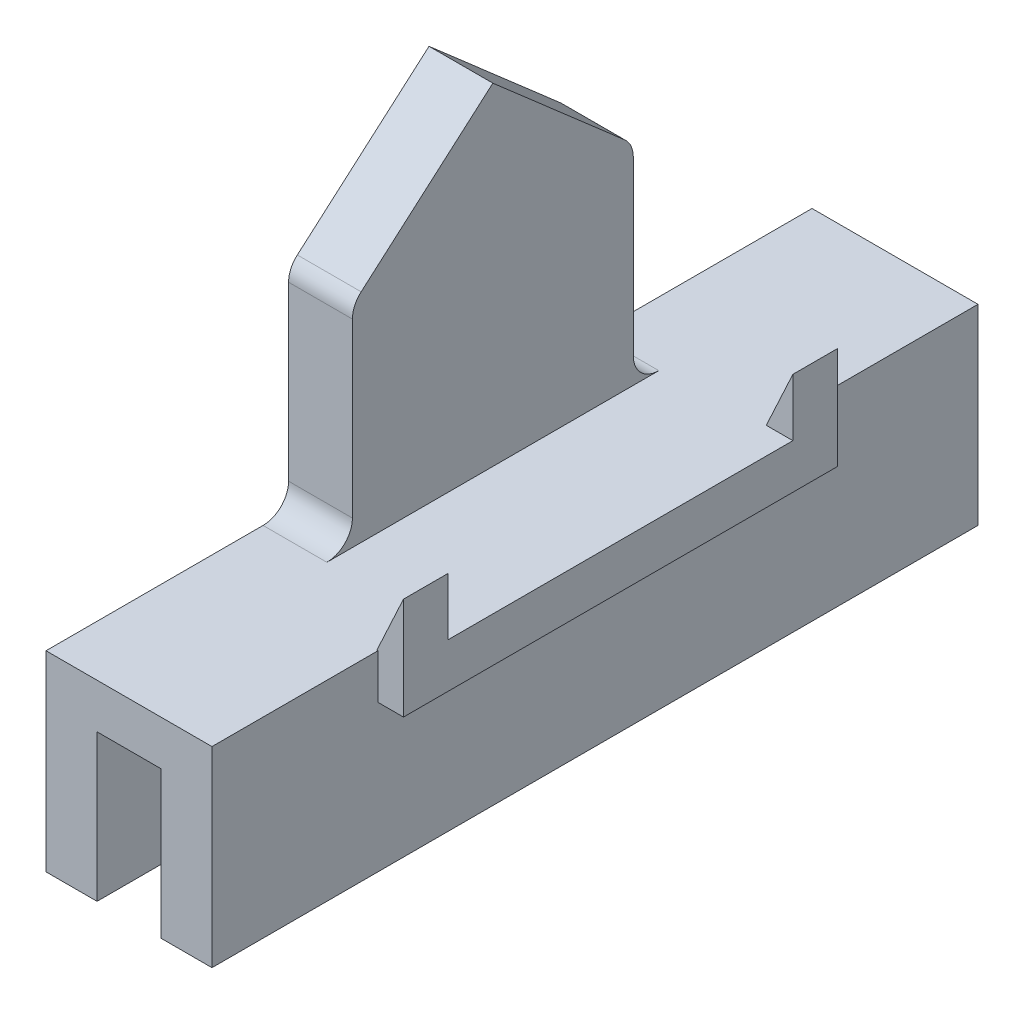
ISO-10303-21;
HEADER;
FILE_DESCRIPTION(('STEP AP214'),'2;1');
FILE_NAME('part.step','',(''),(''),'','','');
FILE_SCHEMA(('AUTOMOTIVE_DESIGN { 1 0 10303 214 1 1 1 1 }'));
ENDSEC;
DATA;
#1=APPLICATION_CONTEXT('core data for automotive mechanical design processes');
#2=APPLICATION_PROTOCOL_DEFINITION('international standard','automotive_design',2000,#1);
#3=PRODUCT_CONTEXT('',#1,'mechanical');
#4=PRODUCT('Part','Part','',(#3));
#5=PRODUCT_RELATED_PRODUCT_CATEGORY('part','',(#4));
#6=PRODUCT_DEFINITION_FORMATION('','',#4);
#7=PRODUCT_DEFINITION_CONTEXT('part definition',#1,'design');
#8=PRODUCT_DEFINITION('design','',#6,#7);
#9=PRODUCT_DEFINITION_SHAPE('','',#8);
#10=(LENGTH_UNIT() NAMED_UNIT(*) SI_UNIT(.MILLI.,.METRE.));
#11=(NAMED_UNIT(*) PLANE_ANGLE_UNIT() SI_UNIT($,.RADIAN.));
#12=(NAMED_UNIT(*) SI_UNIT($,.STERADIAN.) SOLID_ANGLE_UNIT());
#13=UNCERTAINTY_MEASURE_WITH_UNIT(LENGTH_MEASURE(1.E-05),#10,'distance_accuracy_value','');
#14=(GEOMETRIC_REPRESENTATION_CONTEXT(3) GLOBAL_UNCERTAINTY_ASSIGNED_CONTEXT((#13)) GLOBAL_UNIT_ASSIGNED_CONTEXT((#10,
#11,#12)) REPRESENTATION_CONTEXT('',''));
#15=CARTESIAN_POINT('',(0.,0.,0.));
#16=DIRECTION('',(0.,0.,1.));
#17=DIRECTION('',(1.,0.,0.));
#18=AXIS2_PLACEMENT_3D('',#15,#16,#17);
#19=CARTESIAN_POINT('',(-6.5,7.5,60.));
#20=DIRECTION('',(0.,-1.,0.));
#21=DIRECTION('',(0.,0.,-1.));
#22=AXIS2_PLACEMENT_3D('',#19,#20,#21);
#23=PLANE('',#22);
#24=DIRECTION('',(0.,0.,-1.));
#25=VECTOR('',#24,1.);
#26=CARTESIAN_POINT('',(-6.5,7.5,60.));
#27=LINE('',#26,#25);
#28=CARTESIAN_POINT('',(-6.5,7.5,17.));
#29=VERTEX_POINT('',#28);
#30=CARTESIAN_POINT('',(-6.5,7.5,0.));
#31=VERTEX_POINT('',#30);
#32=EDGE_CURVE('E399',#29,#31,#27,.T.);
#33=ORIENTED_EDGE('',*,*,#32,.F.);
#34=DIRECTION('',(-1.,0.,0.));
#35=VECTOR('',#34,1.);
#36=CARTESIAN_POINT('',(-6.5,7.5,17.));
#37=LINE('',#36,#35);
#38=CARTESIAN_POINT('',(-1.5,7.5,17.));
#39=VERTEX_POINT('',#38);
#40=EDGE_CURVE('E433',#29,#39,#37,.F.);
#41=ORIENTED_EDGE('',*,*,#40,.T.);
#42=DIRECTION('',(0.,0.,1.));
#43=VECTOR('',#42,1.);
#44=CARTESIAN_POINT('',(-1.5,7.5,19.));
#45=LINE('',#44,#43);
#46=CARTESIAN_POINT('',(-1.5,7.5,43.));
#47=VERTEX_POINT('',#46);
#48=EDGE_CURVE('E294',#39,#47,#45,.T.);
#49=ORIENTED_EDGE('',*,*,#48,.T.);
#50=DIRECTION('',(-1.,0.,0.));
#51=VECTOR('',#50,1.);
#52=CARTESIAN_POINT('',(-6.5,7.5,43.));
#53=LINE('',#52,#51);
#54=CARTESIAN_POINT('',(-6.5,7.5,43.));
#55=VERTEX_POINT('',#54);
#56=EDGE_CURVE('E415',#47,#55,#53,.T.);
#57=ORIENTED_EDGE('',*,*,#56,.T.);
#58=CARTESIAN_POINT('',(-6.5,7.5,60.));
#59=VERTEX_POINT('',#58);
#60=EDGE_CURVE('E400',#59,#55,#27,.T.);
#61=ORIENTED_EDGE('',*,*,#60,.F.);
#62=DIRECTION('',(-1.,0.,0.));
#63=VECTOR('',#62,1.);
#64=CARTESIAN_POINT('',(-6.5,7.5,60.));
#65=LINE('',#64,#63);
#66=CARTESIAN_POINT('',(6.5,7.5,60.));
#67=VERTEX_POINT('',#66);
#68=EDGE_CURVE('E329',#67,#59,#65,.T.);
#69=ORIENTED_EDGE('',*,*,#68,.F.);
#70=DIRECTION('',(0.,0.,-1.));
#71=VECTOR('',#70,1.);
#72=CARTESIAN_POINT('',(6.5,7.5,60.));
#73=LINE('',#72,#71);
#74=CARTESIAN_POINT('',(6.5,7.5,47.));
#75=VERTEX_POINT('',#74);
#76=EDGE_CURVE('E405',#67,#75,#73,.T.);
#77=ORIENTED_EDGE('',*,*,#76,.T.);
#78=DIRECTION('',(-1.,0.,0.));
#79=VECTOR('',#78,1.);
#80=CARTESIAN_POINT('',(-6.5,7.5,47.));
#81=LINE('',#80,#79);
#82=CARTESIAN_POINT('',(6.41629931773516,7.5,47.));
#83=VERTEX_POINT('',#82);
#84=EDGE_CURVE('E254',#75,#83,#81,.T.);
#85=ORIENTED_EDGE('',*,*,#84,.T.);
#86=DIRECTION('',(0.,0.,-1.));
#87=VECTOR('',#86,1.);
#88=CARTESIAN_POINT('',(6.41629931773516,7.5,60.));
#89=LINE('',#88,#87);
#90=CARTESIAN_POINT('',(6.41629931773516,7.5,43.5));
#91=VERTEX_POINT('',#90);
#92=EDGE_CURVE('E409',#83,#91,#89,.T.);
#93=ORIENTED_EDGE('',*,*,#92,.T.);
#94=DIRECTION('',(-1.,0.,0.));
#95=VECTOR('',#94,1.);
#96=CARTESIAN_POINT('',(-6.5,7.5,43.5));
#97=LINE('',#96,#95);
#98=CARTESIAN_POINT('',(8.5,7.5,43.5));
#99=VERTEX_POINT('',#98);
#100=EDGE_CURVE('E258',#99,#91,#97,.T.);
#101=ORIENTED_EDGE('',*,*,#100,.F.);
#102=DIRECTION('',(0.,0.,1.));
#103=VECTOR('',#102,1.);
#104=CARTESIAN_POINT('',(8.5,7.5,13.));
#105=LINE('',#104,#103);
#106=CARTESIAN_POINT('',(8.5,7.5,16.5));
#107=VERTEX_POINT('',#106);
#108=EDGE_CURVE('E262',#107,#99,#105,.T.);
#109=ORIENTED_EDGE('',*,*,#108,.F.);
#110=DIRECTION('',(1.,0.,0.));
#111=VECTOR('',#110,1.);
#112=CARTESIAN_POINT('',(-6.5,7.5,16.5));
#113=LINE('',#112,#111);
#114=CARTESIAN_POINT('',(6.41629931773516,7.5,16.5));
#115=VERTEX_POINT('',#114);
#116=EDGE_CURVE('E211',#115,#107,#113,.T.);
#117=ORIENTED_EDGE('',*,*,#116,.F.);
#118=DIRECTION('',(0.,0.,1.));
#119=VECTOR('',#118,1.);
#120=CARTESIAN_POINT('',(6.41629931773516,7.5,60.));
#121=LINE('',#120,#119);
#122=CARTESIAN_POINT('',(6.41629931773516,7.5,13.));
#123=VERTEX_POINT('',#122);
#124=EDGE_CURVE('E228',#123,#115,#121,.T.);
#125=ORIENTED_EDGE('',*,*,#124,.F.);
#126=DIRECTION('',(1.,0.,0.));
#127=VECTOR('',#126,1.);
#128=CARTESIAN_POINT('',(-6.5,7.5,13.));
#129=LINE('',#128,#127);
#130=CARTESIAN_POINT('',(6.5,7.5,13.));
#131=VERTEX_POINT('',#130);
#132=EDGE_CURVE('E224',#123,#131,#129,.T.);
#133=ORIENTED_EDGE('',*,*,#132,.T.);
#134=CARTESIAN_POINT('',(6.5,7.5,0.));
#135=VERTEX_POINT('',#134);
#136=EDGE_CURVE('E404',#131,#135,#73,.T.);
#137=ORIENTED_EDGE('',*,*,#136,.T.);
#138=DIRECTION('',(-1.,0.,0.));
#139=VECTOR('',#138,1.);
#140=CARTESIAN_POINT('',(-6.5,7.5,0.));
#141=LINE('',#140,#139);
#142=EDGE_CURVE('E355',#135,#31,#141,.T.);
#143=ORIENTED_EDGE('',*,*,#142,.T.);
#144=EDGE_LOOP('',(#33,#41,#49,#57,#61,#69,#77,#85,#93,#101,#109,#117,#125,#133,#137,#143));
#145=FACE_BOUND('',#144,.T.);
#146=ADVANCED_FACE('F39',(#145),#23,.F.);
#147=CARTESIAN_POINT('',(6.5,-7.5,60.));
#148=DIRECTION('',(-1.,0.,0.));
#149=DIRECTION('',(0.,0.,1.));
#150=AXIS2_PLACEMENT_3D('',#147,#148,#149);
#151=PLANE('',#150);
#152=DIRECTION('',(0.,1.,0.));
#153=VECTOR('',#152,1.);
#154=CARTESIAN_POINT('',(6.5,4.,13.));
#155=LINE('',#154,#153);
#156=CARTESIAN_POINT('',(6.5,4.,13.));
#157=VERTEX_POINT('',#156);
#158=EDGE_CURVE('E266',#157,#131,#155,.T.);
#159=ORIENTED_EDGE('',*,*,#158,.F.);
#160=DIRECTION('',(0.,0.,-1.));
#161=VECTOR('',#160,1.);
#162=CARTESIAN_POINT('',(6.5,4.,47.));
#163=LINE('',#162,#161);
#164=CARTESIAN_POINT('',(6.5,4.,47.));
#165=VERTEX_POINT('',#164);
#166=EDGE_CURVE('E278',#165,#157,#163,.T.);
#167=ORIENTED_EDGE('',*,*,#166,.F.);
#168=DIRECTION('',(0.,-1.,0.));
#169=VECTOR('',#168,1.);
#170=CARTESIAN_POINT('',(6.5,7.5,47.));
#171=LINE('',#170,#169);
#172=EDGE_CURVE('E261',#75,#165,#171,.T.);
#173=ORIENTED_EDGE('',*,*,#172,.F.);
#174=ORIENTED_EDGE('',*,*,#76,.F.);
#175=DIRECTION('',(0.,1.,0.));
#176=VECTOR('',#175,1.);
#177=CARTESIAN_POINT('',(6.5,-7.5,60.));
#178=LINE('',#177,#176);
#179=CARTESIAN_POINT('',(6.5,-7.5,60.));
#180=VERTEX_POINT('',#179);
#181=EDGE_CURVE('E325',#180,#67,#178,.T.);
#182=ORIENTED_EDGE('',*,*,#181,.F.);
#183=DIRECTION('',(0.,0.,-1.));
#184=VECTOR('',#183,1.);
#185=CARTESIAN_POINT('',(6.5,-7.5,60.));
#186=LINE('',#185,#184);
#187=CARTESIAN_POINT('',(6.5,-7.5,0.));
#188=VERTEX_POINT('',#187);
#189=EDGE_CURVE('E351',#180,#188,#186,.T.);
#190=ORIENTED_EDGE('',*,*,#189,.T.);
#191=DIRECTION('',(0.,1.,0.));
#192=VECTOR('',#191,1.);
#193=CARTESIAN_POINT('',(6.5,-7.5,0.));
#194=LINE('',#193,#192);
#195=EDGE_CURVE('E324',#188,#135,#194,.T.);
#196=ORIENTED_EDGE('',*,*,#195,.T.);
#197=ORIENTED_EDGE('',*,*,#136,.F.);
#198=EDGE_LOOP('',(#159,#167,#173,#174,#182,#190,#196,#197));
#199=FACE_BOUND('',#198,.T.);
#200=ADVANCED_FACE('F517',(#199),#151,.F.);
#201=CARTESIAN_POINT('',(-6.5,-7.5,60.));
#202=DIRECTION('',(1.,0.,0.));
#203=DIRECTION('',(0.,0.,-1.));
#204=AXIS2_PLACEMENT_3D('',#201,#202,#203);
#205=PLANE('',#204);
#206=DIRECTION('',(0.,1.,0.));
#207=VECTOR('',#206,1.);
#208=CARTESIAN_POINT('',(-6.5,7.5,41.));
#209=LINE('',#208,#207);
#210=CARTESIAN_POINT('',(-6.5,9.5,41.));
#211=VERTEX_POINT('',#210);
#212=CARTESIAN_POINT('',(-6.5,22.9974014941082,41.));
#213=VERTEX_POINT('',#212);
#214=EDGE_CURVE('E312',#211,#213,#209,.T.);
#215=ORIENTED_EDGE('',*,*,#214,.T.);
#216=CARTESIAN_POINT('',(-6.5,22.9974014941082,39.));
#217=DIRECTION('',(1.,0.,0.));
#218=DIRECTION('',(0.,0.,-1.));
#219=AXIS2_PLACEMENT_3D('',#216,#217,#218);
#220=CIRCLE('',#219,2.);
#221=CARTESIAN_POINT('',(-6.5,24.5047207240752,40.3145298547282));
#222=VERTEX_POINT('',#221);
#223=EDGE_CURVE('E62',#213,#222,#220,.F.);
#224=ORIENTED_EDGE('',*,*,#223,.T.);
#225=DIRECTION('',(0.,0.657264927364085,-0.753659614983504));
#226=VECTOR('',#225,1.);
#227=CARTESIAN_POINT('',(-6.5,33.5,30.));
#228=LINE('',#227,#226);
#229=CARTESIAN_POINT('',(-6.5,33.5,30.));
#230=VERTEX_POINT('',#229);
#231=EDGE_CURVE('E315',#222,#230,#228,.T.);
#232=ORIENTED_EDGE('',*,*,#231,.T.);
#233=DIRECTION('',(0.,-0.657264927364085,-0.753659614983504));
#234=VECTOR('',#233,1.);
#235=CARTESIAN_POINT('',(-6.5,23.9069236864136,19.));
#236=LINE('',#235,#234);
#237=CARTESIAN_POINT('',(-6.5,24.5047207240752,19.6854701452718));
#238=VERTEX_POINT('',#237);
#239=EDGE_CURVE('E295',#230,#238,#236,.T.);
#240=ORIENTED_EDGE('',*,*,#239,.T.);
#241=CARTESIAN_POINT('',(-6.5,22.9974014941082,21.));
#242=DIRECTION('',(1.,0.,0.));
#243=DIRECTION('',(0.,0.,-1.));
#244=AXIS2_PLACEMENT_3D('',#241,#242,#243);
#245=CIRCLE('',#244,2.);
#246=CARTESIAN_POINT('',(-6.5,22.9974014941082,19.));
#247=VERTEX_POINT('',#246);
#248=EDGE_CURVE('E448',#238,#247,#245,.F.);
#249=ORIENTED_EDGE('',*,*,#248,.T.);
#250=DIRECTION('',(0.,-1.,0.));
#251=VECTOR('',#250,1.);
#252=CARTESIAN_POINT('',(-6.5,7.5,19.));
#253=LINE('',#252,#251);
#254=CARTESIAN_POINT('',(-6.5,9.5,19.));
#255=VERTEX_POINT('',#254);
#256=EDGE_CURVE('E290',#247,#255,#253,.T.);
#257=ORIENTED_EDGE('',*,*,#256,.T.);
#258=CARTESIAN_POINT('',(-6.5,9.5,17.));
#259=DIRECTION('',(1.,0.,0.));
#260=DIRECTION('',(0.,0.,-1.));
#261=AXIS2_PLACEMENT_3D('',#258,#259,#260);
#262=CIRCLE('',#261,2.);
#263=EDGE_CURVE('E437',#255,#29,#262,.T.);
#264=ORIENTED_EDGE('',*,*,#263,.T.);
#265=ORIENTED_EDGE('',*,*,#32,.T.);
#266=DIRECTION('',(0.,-1.,0.));
#267=VECTOR('',#266,1.);
#268=CARTESIAN_POINT('',(-6.5,-7.5,0.));
#269=LINE('',#268,#267);
#270=CARTESIAN_POINT('',(-6.5,-7.5,0.));
#271=VERTEX_POINT('',#270);
#272=EDGE_CURVE('E359',#31,#271,#269,.T.);
#273=ORIENTED_EDGE('',*,*,#272,.T.);
#274=DIRECTION('',(0.,0.,-1.));
#275=VECTOR('',#274,1.);
#276=CARTESIAN_POINT('',(-6.5,-7.5,60.));
#277=LINE('',#276,#275);
#278=CARTESIAN_POINT('',(-6.5,-7.5,60.));
#279=VERTEX_POINT('',#278);
#280=EDGE_CURVE('E395',#279,#271,#277,.T.);
#281=ORIENTED_EDGE('',*,*,#280,.F.);
#282=DIRECTION('',(0.,-1.,0.));
#283=VECTOR('',#282,1.);
#284=CARTESIAN_POINT('',(-6.5,-7.5,60.));
#285=LINE('',#284,#283);
#286=EDGE_CURVE('E333',#59,#279,#285,.T.);
#287=ORIENTED_EDGE('',*,*,#286,.F.);
#288=ORIENTED_EDGE('',*,*,#60,.T.);
#289=CARTESIAN_POINT('',(-6.5,9.5,43.));
#290=DIRECTION('',(1.,0.,0.));
#291=DIRECTION('',(0.,0.,-1.));
#292=AXIS2_PLACEMENT_3D('',#289,#290,#291);
#293=CIRCLE('',#292,2.);
#294=EDGE_CURVE('E422',#55,#211,#293,.T.);
#295=ORIENTED_EDGE('',*,*,#294,.T.);
#296=EDGE_LOOP('',(#215,#224,#232,#240,#249,#257,#264,#265,#273,#281,#287,#288,#295));
#297=FACE_BOUND('',#296,.T.);
#298=ADVANCED_FACE('F466',(#297),#205,.F.);
#299=CARTESIAN_POINT('',(-6.5,-7.5,60.));
#300=DIRECTION('',(0.,1.,0.));
#301=DIRECTION('',(0.,0.,1.));
#302=AXIS2_PLACEMENT_3D('',#299,#300,#301);
#303=PLANE('',#302);
#304=DIRECTION('',(1.,0.,0.));
#305=VECTOR('',#304,1.);
#306=CARTESIAN_POINT('',(-6.5,-7.5,0.));
#307=LINE('',#306,#305);
#308=CARTESIAN_POINT('',(-2.5,-7.5,0.));
#309=VERTEX_POINT('',#308);
#310=EDGE_CURVE('E362',#271,#309,#307,.T.);
#311=ORIENTED_EDGE('',*,*,#310,.T.);
#312=DIRECTION('',(0.,0.,-1.));
#313=VECTOR('',#312,1.);
#314=CARTESIAN_POINT('',(-2.5,-7.5,60.));
#315=LINE('',#314,#313);
#316=CARTESIAN_POINT('',(-2.5,-7.5,60.));
#317=VERTEX_POINT('',#316);
#318=EDGE_CURVE('E391',#317,#309,#315,.T.);
#319=ORIENTED_EDGE('',*,*,#318,.F.);
#320=DIRECTION('',(1.,0.,0.));
#321=VECTOR('',#320,1.);
#322=CARTESIAN_POINT('',(-6.5,-7.5,60.));
#323=LINE('',#322,#321);
#324=EDGE_CURVE('E336',#279,#317,#323,.T.);
#325=ORIENTED_EDGE('',*,*,#324,.F.);
#326=ORIENTED_EDGE('',*,*,#280,.T.);
#327=EDGE_LOOP('',(#311,#319,#325,#326));
#328=FACE_BOUND('',#327,.T.);
#329=ADVANCED_FACE('F482',(#328),#303,.F.);
#330=CARTESIAN_POINT('',(-2.5,-7.5,60.));
#331=DIRECTION('',(-1.,0.,0.));
#332=DIRECTION('',(0.,-1.,0.));
#333=AXIS2_PLACEMENT_3D('',#330,#331,#332);
#334=PLANE('',#333);
#335=DIRECTION('',(0.,1.,0.));
#336=VECTOR('',#335,1.);
#337=CARTESIAN_POINT('',(-2.5,-7.5,0.));
#338=LINE('',#337,#336);
#339=CARTESIAN_POINT('',(-2.5,4.,0.));
#340=VERTEX_POINT('',#339);
#341=EDGE_CURVE('E365',#309,#340,#338,.T.);
#342=ORIENTED_EDGE('',*,*,#341,.T.);
#343=DIRECTION('',(0.,0.,-1.));
#344=VECTOR('',#343,1.);
#345=CARTESIAN_POINT('',(-2.5,4.,60.));
#346=LINE('',#345,#344);
#347=CARTESIAN_POINT('',(-2.5,4.,60.));
#348=VERTEX_POINT('',#347);
#349=EDGE_CURVE('E387',#348,#340,#346,.T.);
#350=ORIENTED_EDGE('',*,*,#349,.F.);
#351=DIRECTION('',(0.,1.,0.));
#352=VECTOR('',#351,1.);
#353=CARTESIAN_POINT('',(-2.5,-7.5,60.));
#354=LINE('',#353,#352);
#355=EDGE_CURVE('E339',#317,#348,#354,.T.);
#356=ORIENTED_EDGE('',*,*,#355,.F.);
#357=ORIENTED_EDGE('',*,*,#318,.T.);
#358=EDGE_LOOP('',(#342,#350,#356,#357));
#359=FACE_BOUND('',#358,.T.);
#360=ADVANCED_FACE('F486',(#359),#334,.F.);
#361=CARTESIAN_POINT('',(-2.5,4.,60.));
#362=DIRECTION('',(0.,1.,0.));
#363=DIRECTION('',(-1.,0.,0.));
#364=AXIS2_PLACEMENT_3D('',#361,#362,#363);
#365=PLANE('',#364);
#366=DIRECTION('',(1.,0.,0.));
#367=VECTOR('',#366,1.);
#368=CARTESIAN_POINT('',(-2.5,4.,0.));
#369=LINE('',#368,#367);
#370=CARTESIAN_POINT('',(2.5,4.,0.));
#371=VERTEX_POINT('',#370);
#372=EDGE_CURVE('E368',#340,#371,#369,.T.);
#373=ORIENTED_EDGE('',*,*,#372,.T.);
#374=DIRECTION('',(0.,0.,-1.));
#375=VECTOR('',#374,1.);
#376=CARTESIAN_POINT('',(2.5,4.,60.));
#377=LINE('',#376,#375);
#378=CARTESIAN_POINT('',(2.5,4.,60.));
#379=VERTEX_POINT('',#378);
#380=EDGE_CURVE('E383',#379,#371,#377,.T.);
#381=ORIENTED_EDGE('',*,*,#380,.F.);
#382=DIRECTION('',(1.,0.,0.));
#383=VECTOR('',#382,1.);
#384=CARTESIAN_POINT('',(-2.5,4.,60.));
#385=LINE('',#384,#383);
#386=EDGE_CURVE('E342',#348,#379,#385,.T.);
#387=ORIENTED_EDGE('',*,*,#386,.F.);
#388=ORIENTED_EDGE('',*,*,#349,.T.);
#389=EDGE_LOOP('',(#373,#381,#387,#388));
#390=FACE_BOUND('',#389,.T.);
#391=ADVANCED_FACE('F570',(#390),#365,.F.);
#392=CARTESIAN_POINT('',(2.5,-7.5,60.));
#393=DIRECTION('',(1.,0.,0.));
#394=DIRECTION('',(0.,1.,0.));
#395=AXIS2_PLACEMENT_3D('',#392,#393,#394);
#396=PLANE('',#395);
#397=DIRECTION('',(0.,-1.,0.));
#398=VECTOR('',#397,1.);
#399=CARTESIAN_POINT('',(2.5,-7.5,0.));
#400=LINE('',#399,#398);
#401=CARTESIAN_POINT('',(2.5,-7.5,0.));
#402=VERTEX_POINT('',#401);
#403=EDGE_CURVE('E371',#371,#402,#400,.T.);
#404=ORIENTED_EDGE('',*,*,#403,.T.);
#405=DIRECTION('',(0.,0.,-1.));
#406=VECTOR('',#405,1.);
#407=CARTESIAN_POINT('',(2.5,-7.5,60.));
#408=LINE('',#407,#406);
#409=CARTESIAN_POINT('',(2.5,-7.5,60.));
#410=VERTEX_POINT('',#409);
#411=EDGE_CURVE('E379',#410,#402,#408,.T.);
#412=ORIENTED_EDGE('',*,*,#411,.F.);
#413=DIRECTION('',(0.,-1.,0.));
#414=VECTOR('',#413,1.);
#415=CARTESIAN_POINT('',(2.5,-7.5,60.));
#416=LINE('',#415,#414);
#417=EDGE_CURVE('E345',#379,#410,#416,.T.);
#418=ORIENTED_EDGE('',*,*,#417,.F.);
#419=ORIENTED_EDGE('',*,*,#380,.T.);
#420=EDGE_LOOP('',(#404,#412,#418,#419));
#421=FACE_BOUND('',#420,.T.);
#422=ADVANCED_FACE('F566',(#421),#396,.F.);
#423=CARTESIAN_POINT('',(2.5,-7.5,60.));
#424=DIRECTION('',(0.,1.,0.));
#425=DIRECTION('',(0.,0.,1.));
#426=AXIS2_PLACEMENT_3D('',#423,#424,#425);
#427=PLANE('',#426);
#428=DIRECTION('',(1.,0.,0.));
#429=VECTOR('',#428,1.);
#430=CARTESIAN_POINT('',(2.5,-7.5,0.));
#431=LINE('',#430,#429);
#432=EDGE_CURVE('E330',#402,#188,#431,.T.);
#433=ORIENTED_EDGE('',*,*,#432,.T.);
#434=ORIENTED_EDGE('',*,*,#189,.F.);
#435=DIRECTION('',(1.,0.,0.));
#436=VECTOR('',#435,1.);
#437=CARTESIAN_POINT('',(2.5,-7.5,60.));
#438=LINE('',#437,#436);
#439=EDGE_CURVE('E348',#410,#180,#438,.T.);
#440=ORIENTED_EDGE('',*,*,#439,.F.);
#441=ORIENTED_EDGE('',*,*,#411,.T.);
#442=EDGE_LOOP('',(#433,#434,#440,#441));
#443=FACE_BOUND('',#442,.T.);
#444=ADVANCED_FACE('F561',(#443),#427,.F.);
#445=CARTESIAN_POINT('',(0.,0.,60.));
#446=DIRECTION('',(0.,0.,-1.));
#447=DIRECTION('',(-1.,0.,0.));
#448=AXIS2_PLACEMENT_3D('',#445,#446,#447);
#449=PLANE('',#448);
#450=ORIENTED_EDGE('',*,*,#181,.T.);
#451=ORIENTED_EDGE('',*,*,#68,.T.);
#452=ORIENTED_EDGE('',*,*,#286,.T.);
#453=ORIENTED_EDGE('',*,*,#324,.T.);
#454=ORIENTED_EDGE('',*,*,#355,.T.);
#455=ORIENTED_EDGE('',*,*,#386,.T.);
#456=ORIENTED_EDGE('',*,*,#417,.T.);
#457=ORIENTED_EDGE('',*,*,#439,.T.);
#458=EDGE_LOOP('',(#450,#451,#452,#453,#454,#455,#456,#457));
#459=FACE_BOUND('',#458,.T.);
#460=ADVANCED_FACE('F490',(#459),#449,.F.);
#461=CARTESIAN_POINT('',(0.,0.,0.));
#462=DIRECTION('',(0.,0.,-1.));
#463=DIRECTION('',(-1.,0.,0.));
#464=AXIS2_PLACEMENT_3D('',#461,#462,#463);
#465=PLANE('',#464);
#466=ORIENTED_EDGE('',*,*,#195,.F.);
#467=ORIENTED_EDGE('',*,*,#432,.F.);
#468=ORIENTED_EDGE('',*,*,#403,.F.);
#469=ORIENTED_EDGE('',*,*,#372,.F.);
#470=ORIENTED_EDGE('',*,*,#341,.F.);
#471=ORIENTED_EDGE('',*,*,#310,.F.);
#472=ORIENTED_EDGE('',*,*,#272,.F.);
#473=ORIENTED_EDGE('',*,*,#142,.F.);
#474=EDGE_LOOP('',(#466,#467,#468,#469,#470,#471,#472,#473));
#475=FACE_BOUND('',#474,.T.);
#476=ADVANCED_FACE('F477',(#475),#465,.T.);
#477=CARTESIAN_POINT('',(-1.5,7.5,19.));
#478=DIRECTION('',(0.,0.,-1.));
#479=DIRECTION('',(0.,1.,0.));
#480=AXIS2_PLACEMENT_3D('',#477,#478,#479);
#481=PLANE('',#480);
#482=ORIENTED_EDGE('',*,*,#256,.F.);
#483=DIRECTION('',(-1.,0.,0.));
#484=VECTOR('',#483,1.);
#485=CARTESIAN_POINT('',(-1.5,22.9974014941082,19.));
#486=LINE('',#485,#484);
#487=CARTESIAN_POINT('',(-1.5,22.9974014941082,19.));
#488=VERTEX_POINT('',#487);
#489=EDGE_CURVE('E451',#247,#488,#486,.F.);
#490=ORIENTED_EDGE('',*,*,#489,.T.);
#491=DIRECTION('',(0.,-1.,0.));
#492=VECTOR('',#491,1.);
#493=CARTESIAN_POINT('',(-1.5,7.5,19.));
#494=LINE('',#493,#492);
#495=CARTESIAN_POINT('',(-1.5,9.5,19.));
#496=VERTEX_POINT('',#495);
#497=EDGE_CURVE('E291',#488,#496,#494,.T.);
#498=ORIENTED_EDGE('',*,*,#497,.T.);
#499=DIRECTION('',(-1.,0.,0.));
#500=VECTOR('',#499,1.);
#501=CARTESIAN_POINT('',(-1.5,9.5,19.));
#502=LINE('',#501,#500);
#503=EDGE_CURVE('E429',#496,#255,#502,.T.);
#504=ORIENTED_EDGE('',*,*,#503,.T.);
#505=EDGE_LOOP('',(#482,#490,#498,#504));
#506=FACE_BOUND('',#505,.T.);
#507=ADVANCED_FACE('F553',(#506),#481,.T.);
#508=CARTESIAN_POINT('',(-1.5,23.9069236864136,19.));
#509=DIRECTION('',(0.,0.753659614983504,-0.657264927364085));
#510=DIRECTION('',(0.,0.657264927364085,0.753659614983504));
#511=AXIS2_PLACEMENT_3D('',#508,#509,#510);
#512=PLANE('',#511);
#513=DIRECTION('',(0.,-0.657264927364085,-0.753659614983504));
#514=VECTOR('',#513,1.);
#515=CARTESIAN_POINT('',(-1.5,23.9069236864136,19.));
#516=LINE('',#515,#514);
#517=CARTESIAN_POINT('',(-1.5,33.5,30.));
#518=VERTEX_POINT('',#517);
#519=CARTESIAN_POINT('',(-1.5,24.5047207240752,19.6854701452718));
#520=VERTEX_POINT('',#519);
#521=EDGE_CURVE('E305',#518,#520,#516,.T.);
#522=ORIENTED_EDGE('',*,*,#521,.T.);
#523=DIRECTION('',(-1.,0.,0.));
#524=VECTOR('',#523,1.);
#525=CARTESIAN_POINT('',(-1.5,24.5047207240752,19.6854701452718));
#526=LINE('',#525,#524);
#527=EDGE_CURVE('E444',#520,#238,#526,.T.);
#528=ORIENTED_EDGE('',*,*,#527,.T.);
#529=ORIENTED_EDGE('',*,*,#239,.F.);
#530=DIRECTION('',(-1.,0.,0.));
#531=VECTOR('',#530,1.);
#532=CARTESIAN_POINT('',(-1.5,33.5,30.));
#533=LINE('',#532,#531);
#534=EDGE_CURVE('E309',#518,#230,#533,.T.);
#535=ORIENTED_EDGE('',*,*,#534,.F.);
#536=EDGE_LOOP('',(#522,#528,#529,#535));
#537=FACE_BOUND('',#536,.T.);
#538=ADVANCED_FACE('F542',(#537),#512,.T.);
#539=CARTESIAN_POINT('',(-1.5,33.5,30.));
#540=DIRECTION('',(0.,0.753659614983504,0.657264927364085));
#541=DIRECTION('',(0.,-0.657264927364085,0.753659614983504));
#542=AXIS2_PLACEMENT_3D('',#539,#540,#541);
#543=PLANE('',#542);
#544=ORIENTED_EDGE('',*,*,#231,.F.);
#545=DIRECTION('',(-1.,0.,0.));
#546=VECTOR('',#545,1.);
#547=CARTESIAN_POINT('',(-1.5,24.5047207240752,40.3145298547282));
#548=LINE('',#547,#546);
#549=CARTESIAN_POINT('',(-1.5,24.5047207240752,40.3145298547282));
#550=VERTEX_POINT('',#549);
#551=EDGE_CURVE('E48',#222,#550,#548,.F.);
#552=ORIENTED_EDGE('',*,*,#551,.T.);
#553=DIRECTION('',(0.,0.657264927364085,-0.753659614983504));
#554=VECTOR('',#553,1.);
#555=CARTESIAN_POINT('',(-1.5,33.5,30.));
#556=LINE('',#555,#554);
#557=EDGE_CURVE('E302',#550,#518,#556,.T.);
#558=ORIENTED_EDGE('',*,*,#557,.T.);
#559=ORIENTED_EDGE('',*,*,#534,.T.);
#560=EDGE_LOOP('',(#544,#552,#558,#559));
#561=FACE_BOUND('',#560,.T.);
#562=ADVANCED_FACE('F545',(#561),#543,.T.);
#563=CARTESIAN_POINT('',(-1.5,7.5,41.));
#564=DIRECTION('',(0.,0.,1.));
#565=DIRECTION('',(0.,-1.,0.));
#566=AXIS2_PLACEMENT_3D('',#563,#564,#565);
#567=PLANE('',#566);
#568=DIRECTION('',(0.,1.,0.));
#569=VECTOR('',#568,1.);
#570=CARTESIAN_POINT('',(-1.5,7.5,41.));
#571=LINE('',#570,#569);
#572=CARTESIAN_POINT('',(-1.5,9.5,41.));
#573=VERTEX_POINT('',#572);
#574=CARTESIAN_POINT('',(-1.5,22.9974014941082,41.));
#575=VERTEX_POINT('',#574);
#576=EDGE_CURVE('E298',#573,#575,#571,.T.);
#577=ORIENTED_EDGE('',*,*,#576,.T.);
#578=DIRECTION('',(-1.,0.,0.));
#579=VECTOR('',#578,1.);
#580=CARTESIAN_POINT('',(-1.5,22.9974014941082,41.));
#581=LINE('',#580,#579);
#582=EDGE_CURVE('E457',#575,#213,#581,.T.);
#583=ORIENTED_EDGE('',*,*,#582,.T.);
#584=ORIENTED_EDGE('',*,*,#214,.F.);
#585=DIRECTION('',(-1.,0.,0.));
#586=VECTOR('',#585,1.);
#587=CARTESIAN_POINT('',(-1.5,9.5,41.));
#588=LINE('',#587,#586);
#589=EDGE_CURVE('E419',#211,#573,#588,.F.);
#590=ORIENTED_EDGE('',*,*,#589,.T.);
#591=EDGE_LOOP('',(#577,#583,#584,#590));
#592=FACE_BOUND('',#591,.T.);
#593=ADVANCED_FACE('F502',(#592),#567,.T.);
#594=CARTESIAN_POINT('',(-1.5,0.,0.));
#595=DIRECTION('',(1.,0.,0.));
#596=DIRECTION('',(0.,0.,-1.));
#597=AXIS2_PLACEMENT_3D('',#594,#595,#596);
#598=PLANE('',#597);
#599=ORIENTED_EDGE('',*,*,#557,.F.);
#600=CARTESIAN_POINT('',(-1.5,22.9974014941082,39.));
#601=DIRECTION('',(1.,0.,0.));
#602=DIRECTION('',(0.,0.,-1.));
#603=AXIS2_PLACEMENT_3D('',#600,#601,#602);
#604=CIRCLE('',#603,2.);
#605=EDGE_CURVE('E11',#550,#575,#604,.T.);
#606=ORIENTED_EDGE('',*,*,#605,.T.);
#607=ORIENTED_EDGE('',*,*,#576,.F.);
#608=CARTESIAN_POINT('',(-1.5,9.5,43.));
#609=DIRECTION('',(1.,0.,0.));
#610=DIRECTION('',(0.,0.,-1.));
#611=AXIS2_PLACEMENT_3D('',#608,#609,#610);
#612=CIRCLE('',#611,2.);
#613=EDGE_CURVE('E425',#573,#47,#612,.F.);
#614=ORIENTED_EDGE('',*,*,#613,.T.);
#615=ORIENTED_EDGE('',*,*,#48,.F.);
#616=CARTESIAN_POINT('',(-1.5,9.5,17.));
#617=DIRECTION('',(1.,0.,0.));
#618=DIRECTION('',(0.,0.,-1.));
#619=AXIS2_PLACEMENT_3D('',#616,#617,#618);
#620=CIRCLE('',#619,2.);
#621=EDGE_CURVE('E440',#39,#496,#620,.F.);
#622=ORIENTED_EDGE('',*,*,#621,.T.);
#623=ORIENTED_EDGE('',*,*,#497,.F.);
#624=CARTESIAN_POINT('',(-1.5,22.9974014941082,21.));
#625=DIRECTION('',(1.,0.,0.));
#626=DIRECTION('',(0.,0.,-1.));
#627=AXIS2_PLACEMENT_3D('',#624,#625,#626);
#628=CIRCLE('',#627,2.);
#629=EDGE_CURVE('E454',#488,#520,#628,.T.);
#630=ORIENTED_EDGE('',*,*,#629,.T.);
#631=ORIENTED_EDGE('',*,*,#521,.F.);
#632=EDGE_LOOP('',(#599,#606,#607,#614,#615,#622,#623,#630,#631));
#633=FACE_BOUND('',#632,.T.);
#634=ADVANCED_FACE('F505',(#633),#598,.T.);
#635=CARTESIAN_POINT('',(8.5,7.5,47.));
#636=DIRECTION('',(0.,0.,-1.));
#637=DIRECTION('',(-1.,0.,0.));
#638=AXIS2_PLACEMENT_3D('',#635,#636,#637);
#639=PLANE('',#638);
#640=ORIENTED_EDGE('',*,*,#172,.T.);
#641=DIRECTION('',(-1.,0.,0.));
#642=VECTOR('',#641,1.);
#643=CARTESIAN_POINT('',(8.5,4.,47.));
#644=LINE('',#643,#642);
#645=CARTESIAN_POINT('',(8.5,4.,47.));
#646=VERTEX_POINT('',#645);
#647=EDGE_CURVE('E286',#646,#165,#644,.T.);
#648=ORIENTED_EDGE('',*,*,#647,.F.);
#649=DIRECTION('',(0.,-1.,0.));
#650=VECTOR('',#649,1.);
#651=CARTESIAN_POINT('',(8.5,7.5,47.));
#652=LINE('',#651,#650);
#653=CARTESIAN_POINT('',(8.5,12.,47.));
#654=VERTEX_POINT('',#653);
#655=EDGE_CURVE('E265',#654,#646,#652,.T.);
#656=ORIENTED_EDGE('',*,*,#655,.F.);
#657=DIRECTION('',(-0.420184569311461,-0.907438663333529,0.));
#658=VECTOR('',#657,1.);
#659=CARTESIAN_POINT('',(8.5,12.,47.));
#660=LINE('',#659,#658);
#661=EDGE_CURVE('E240',#654,#83,#660,.T.);
#662=ORIENTED_EDGE('',*,*,#661,.T.);
#663=ORIENTED_EDGE('',*,*,#84,.F.);
#664=EDGE_LOOP('',(#640,#648,#656,#662,#663));
#665=FACE_BOUND('',#664,.T.);
#666=ADVANCED_FACE('F606',(#665),#639,.F.);
#667=CARTESIAN_POINT('',(8.5,4.,47.));
#668=DIRECTION('',(0.,1.,0.));
#669=DIRECTION('',(0.,0.,1.));
#670=AXIS2_PLACEMENT_3D('',#667,#668,#669);
#671=PLANE('',#670);
#672=DIRECTION('',(-1.,0.,0.));
#673=VECTOR('',#672,1.);
#674=CARTESIAN_POINT('',(8.5,4.,13.));
#675=LINE('',#674,#673);
#676=CARTESIAN_POINT('',(8.5,4.,13.));
#677=VERTEX_POINT('',#676);
#678=EDGE_CURVE('E274',#677,#157,#675,.T.);
#679=ORIENTED_EDGE('',*,*,#678,.F.);
#680=DIRECTION('',(0.,0.,-1.));
#681=VECTOR('',#680,1.);
#682=CARTESIAN_POINT('',(8.5,4.,47.));
#683=LINE('',#682,#681);
#684=EDGE_CURVE('E269',#646,#677,#683,.T.);
#685=ORIENTED_EDGE('',*,*,#684,.F.);
#686=ORIENTED_EDGE('',*,*,#647,.T.);
#687=ORIENTED_EDGE('',*,*,#166,.T.);
#688=EDGE_LOOP('',(#679,#685,#686,#687));
#689=FACE_BOUND('',#688,.T.);
#690=ADVANCED_FACE('F600',(#689),#671,.F.);
#691=CARTESIAN_POINT('',(8.5,4.,13.));
#692=DIRECTION('',(0.,0.,1.));
#693=DIRECTION('',(1.,0.,0.));
#694=AXIS2_PLACEMENT_3D('',#691,#692,#693);
#695=PLANE('',#694);
#696=ORIENTED_EDGE('',*,*,#158,.T.);
#697=ORIENTED_EDGE('',*,*,#132,.F.);
#698=DIRECTION('',(-0.420184569311461,-0.907438663333529,0.));
#699=VECTOR('',#698,1.);
#700=CARTESIAN_POINT('',(8.5,12.,13.));
#701=LINE('',#700,#699);
#702=CARTESIAN_POINT('',(8.5,12.,13.));
#703=VERTEX_POINT('',#702);
#704=EDGE_CURVE('E230',#703,#123,#701,.T.);
#705=ORIENTED_EDGE('',*,*,#704,.F.);
#706=DIRECTION('',(0.,1.,0.));
#707=VECTOR('',#706,1.);
#708=CARTESIAN_POINT('',(8.5,4.,13.));
#709=LINE('',#708,#707);
#710=EDGE_CURVE('E219',#677,#703,#709,.T.);
#711=ORIENTED_EDGE('',*,*,#710,.F.);
#712=ORIENTED_EDGE('',*,*,#678,.T.);
#713=EDGE_LOOP('',(#696,#697,#705,#711,#712));
#714=FACE_BOUND('',#713,.T.);
#715=ADVANCED_FACE('F605',(#714),#695,.F.);
#716=CARTESIAN_POINT('',(8.5,0.,0.));
#717=DIRECTION('',(1.,0.,0.));
#718=DIRECTION('',(0.,0.,-1.));
#719=AXIS2_PLACEMENT_3D('',#716,#717,#718);
#720=PLANE('',#719);
#721=ORIENTED_EDGE('',*,*,#710,.T.);
#722=DIRECTION('',(0.,0.,-1.));
#723=VECTOR('',#722,1.);
#724=CARTESIAN_POINT('',(8.5,12.,16.5));
#725=LINE('',#724,#723);
#726=CARTESIAN_POINT('',(8.5,12.,16.5));
#727=VERTEX_POINT('',#726);
#728=EDGE_CURVE('E214',#727,#703,#725,.T.);
#729=ORIENTED_EDGE('',*,*,#728,.F.);
#730=DIRECTION('',(0.,1.,0.));
#731=VECTOR('',#730,1.);
#732=CARTESIAN_POINT('',(8.5,4.,16.5));
#733=LINE('',#732,#731);
#734=EDGE_CURVE('E206',#107,#727,#733,.T.);
#735=ORIENTED_EDGE('',*,*,#734,.F.);
#736=ORIENTED_EDGE('',*,*,#108,.T.);
#737=DIRECTION('',(0.,1.,0.));
#738=VECTOR('',#737,1.);
#739=CARTESIAN_POINT('',(8.5,4.,43.5));
#740=LINE('',#739,#738);
#741=CARTESIAN_POINT('',(8.5,12.,43.5));
#742=VERTEX_POINT('',#741);
#743=EDGE_CURVE('E241',#99,#742,#740,.T.);
#744=ORIENTED_EDGE('',*,*,#743,.T.);
#745=DIRECTION('',(0.,0.,1.));
#746=VECTOR('',#745,1.);
#747=CARTESIAN_POINT('',(8.5,12.,43.5));
#748=LINE('',#747,#746);
#749=EDGE_CURVE('E248',#742,#654,#748,.T.);
#750=ORIENTED_EDGE('',*,*,#749,.T.);
#751=ORIENTED_EDGE('',*,*,#655,.T.);
#752=ORIENTED_EDGE('',*,*,#684,.T.);
#753=EDGE_LOOP('',(#721,#729,#735,#736,#744,#750,#751,#752));
#754=FACE_BOUND('',#753,.T.);
#755=ADVANCED_FACE('F217',(#754),#720,.T.);
#756=CARTESIAN_POINT('',(8.5,12.,43.5));
#757=DIRECTION('',(-0.907438663333529,0.420184569311461,0.));
#758=DIRECTION('',(-0.420184569311461,-0.907438663333529,0.));
#759=AXIS2_PLACEMENT_3D('',#756,#757,#758);
#760=PLANE('',#759);
#761=ORIENTED_EDGE('',*,*,#92,.F.);
#762=ORIENTED_EDGE('',*,*,#661,.F.);
#763=ORIENTED_EDGE('',*,*,#749,.F.);
#764=DIRECTION('',(-0.420184569311461,-0.907438663333529,0.));
#765=VECTOR('',#764,1.);
#766=CARTESIAN_POINT('',(8.5,12.,43.5));
#767=LINE('',#766,#765);
#768=EDGE_CURVE('E244',#742,#91,#767,.T.);
#769=ORIENTED_EDGE('',*,*,#768,.T.);
#770=EDGE_LOOP('',(#761,#762,#763,#769));
#771=FACE_BOUND('',#770,.T.);
#772=ADVANCED_FACE('F628',(#771),#760,.T.);
#773=CARTESIAN_POINT('',(0.,0.,43.5));
#774=DIRECTION('',(0.,0.,1.));
#775=DIRECTION('',(1.,0.,0.));
#776=AXIS2_PLACEMENT_3D('',#773,#774,#775);
#777=PLANE('',#776);
#778=ORIENTED_EDGE('',*,*,#743,.F.);
#779=ORIENTED_EDGE('',*,*,#100,.T.);
#780=ORIENTED_EDGE('',*,*,#768,.F.);
#781=EDGE_LOOP('',(#778,#779,#780));
#782=FACE_BOUND('',#781,.T.);
#783=ADVANCED_FACE('F595',(#782),#777,.F.);
#784=CARTESIAN_POINT('',(8.5,12.,16.5));
#785=DIRECTION('',(0.907438663333529,-0.420184569311461,0.));
#786=DIRECTION('',(0.420184569311461,0.907438663333529,0.));
#787=AXIS2_PLACEMENT_3D('',#784,#785,#786);
#788=PLANE('',#787);
#789=ORIENTED_EDGE('',*,*,#704,.T.);
#790=ORIENTED_EDGE('',*,*,#124,.T.);
#791=DIRECTION('',(-0.420184569311461,-0.907438663333529,0.));
#792=VECTOR('',#791,1.);
#793=CARTESIAN_POINT('',(8.5,12.,16.5));
#794=LINE('',#793,#792);
#795=EDGE_CURVE('E210',#727,#115,#794,.T.);
#796=ORIENTED_EDGE('',*,*,#795,.F.);
#797=ORIENTED_EDGE('',*,*,#728,.T.);
#798=EDGE_LOOP('',(#789,#790,#796,#797));
#799=FACE_BOUND('',#798,.T.);
#800=ADVANCED_FACE('F227',(#799),#788,.F.);
#801=CARTESIAN_POINT('',(0.,0.,16.5));
#802=DIRECTION('',(0.,0.,-1.));
#803=DIRECTION('',(1.,0.,0.));
#804=AXIS2_PLACEMENT_3D('',#801,#802,#803);
#805=PLANE('',#804);
#806=ORIENTED_EDGE('',*,*,#795,.T.);
#807=ORIENTED_EDGE('',*,*,#116,.T.);
#808=ORIENTED_EDGE('',*,*,#734,.T.);
#809=EDGE_LOOP('',(#806,#807,#808));
#810=FACE_BOUND('',#809,.T.);
#811=ADVANCED_FACE('F208',(#810),#805,.F.);
#812=CARTESIAN_POINT('',(-6.5,9.5,43.));
#813=DIRECTION('',(-1.,0.,0.));
#814=DIRECTION('',(0.,0.,1.));
#815=AXIS2_PLACEMENT_3D('',#812,#813,#814);
#816=CYLINDRICAL_SURFACE('',#815,2.);
#817=ORIENTED_EDGE('',*,*,#613,.F.);
#818=ORIENTED_EDGE('',*,*,#589,.F.);
#819=ORIENTED_EDGE('',*,*,#294,.F.);
#820=ORIENTED_EDGE('',*,*,#56,.F.);
#821=EDGE_LOOP('',(#817,#818,#819,#820));
#822=FACE_BOUND('',#821,.T.);
#823=ADVANCED_FACE('F498',(#822),#816,.F.);
#824=CARTESIAN_POINT('',(-1.5,9.5,17.));
#825=DIRECTION('',(-1.,0.,0.));
#826=DIRECTION('',(0.,0.,1.));
#827=AXIS2_PLACEMENT_3D('',#824,#825,#826);
#828=CYLINDRICAL_SURFACE('',#827,2.);
#829=ORIENTED_EDGE('',*,*,#621,.F.);
#830=ORIENTED_EDGE('',*,*,#40,.F.);
#831=ORIENTED_EDGE('',*,*,#263,.F.);
#832=ORIENTED_EDGE('',*,*,#503,.F.);
#833=EDGE_LOOP('',(#829,#830,#831,#832));
#834=FACE_BOUND('',#833,.T.);
#835=ADVANCED_FACE('F514',(#834),#828,.F.);
#836=CARTESIAN_POINT('',(-1.5,22.9974014941082,21.));
#837=DIRECTION('',(-1.,0.,0.));
#838=DIRECTION('',(0.,0.,1.));
#839=AXIS2_PLACEMENT_3D('',#836,#837,#838);
#840=CYLINDRICAL_SURFACE('',#839,2.);
#841=ORIENTED_EDGE('',*,*,#629,.F.);
#842=ORIENTED_EDGE('',*,*,#489,.F.);
#843=ORIENTED_EDGE('',*,*,#248,.F.);
#844=ORIENTED_EDGE('',*,*,#527,.F.);
#845=EDGE_LOOP('',(#841,#842,#843,#844));
#846=FACE_BOUND('',#845,.T.);
#847=ADVANCED_FACE('F510',(#846),#840,.T.);
#848=CARTESIAN_POINT('',(-1.5,22.9974014941082,39.));
#849=DIRECTION('',(-1.,0.,0.));
#850=DIRECTION('',(0.,0.,1.));
#851=AXIS2_PLACEMENT_3D('',#848,#849,#850);
#852=CYLINDRICAL_SURFACE('',#851,2.);
#853=ORIENTED_EDGE('',*,*,#605,.F.);
#854=ORIENTED_EDGE('',*,*,#551,.F.);
#855=ORIENTED_EDGE('',*,*,#223,.F.);
#856=ORIENTED_EDGE('',*,*,#582,.F.);
#857=EDGE_LOOP('',(#853,#854,#855,#856));
#858=FACE_BOUND('',#857,.T.);
#859=ADVANCED_FACE('F41',(#858),#852,.T.);
#860=CLOSED_SHELL('',(#146,#200,#298,#329,#360,#391,#422,#444,#460,#476,#507,#538,#562,#593,
#634,#666,#690,#715,#755,#772,#783,#800,#811,#823,#835,#847,#859));
#861=MANIFOLD_SOLID_BREP('B2',#860);
#862=ADVANCED_BREP_SHAPE_REPRESENTATION('',(#18,#861),#14);
#863=SHAPE_DEFINITION_REPRESENTATION(#9,#862);
ENDSEC;
END-ISO-10303-21;
